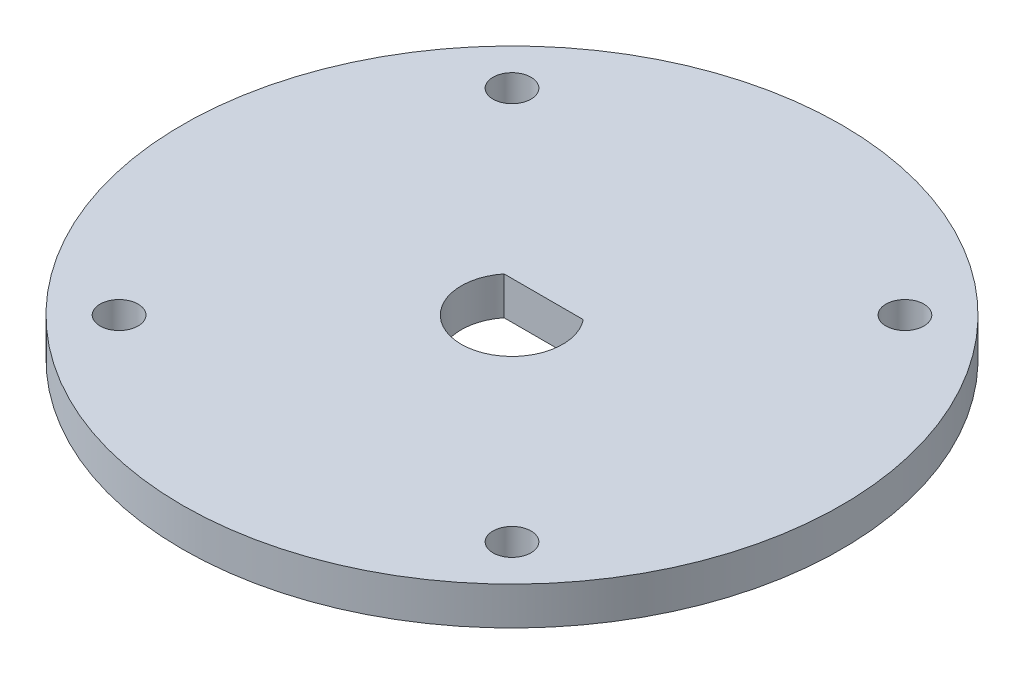
ISO-10303-21;
HEADER;
FILE_DESCRIPTION(('STEP AP214'),'2;1');
FILE_NAME('part.step','',(''),(''),'','','');
FILE_SCHEMA(('AUTOMOTIVE_DESIGN { 1 0 10303 214 1 1 1 1 }'));
ENDSEC;
DATA;
#1=APPLICATION_CONTEXT('core data for automotive mechanical design processes');
#2=APPLICATION_PROTOCOL_DEFINITION('international standard','automotive_design',2000,#1);
#3=PRODUCT_CONTEXT('',#1,'mechanical');
#4=PRODUCT('Part','Part','',(#3));
#5=PRODUCT_RELATED_PRODUCT_CATEGORY('part','',(#4));
#6=PRODUCT_DEFINITION_FORMATION('','',#4);
#7=PRODUCT_DEFINITION_CONTEXT('part definition',#1,'design');
#8=PRODUCT_DEFINITION('design','',#6,#7);
#9=PRODUCT_DEFINITION_SHAPE('','',#8);
#10=(LENGTH_UNIT() NAMED_UNIT(*) SI_UNIT(.MILLI.,.METRE.));
#11=(NAMED_UNIT(*) PLANE_ANGLE_UNIT() SI_UNIT($,.RADIAN.));
#12=(NAMED_UNIT(*) SI_UNIT($,.STERADIAN.) SOLID_ANGLE_UNIT());
#13=UNCERTAINTY_MEASURE_WITH_UNIT(LENGTH_MEASURE(1.E-05),#10,'distance_accuracy_value','');
#14=(GEOMETRIC_REPRESENTATION_CONTEXT(3) GLOBAL_UNCERTAINTY_ASSIGNED_CONTEXT((#13)) GLOBAL_UNIT_ASSIGNED_CONTEXT((#10,
#11,#12)) REPRESENTATION_CONTEXT('',''));
#15=CARTESIAN_POINT('',(0.,0.,0.));
#16=DIRECTION('',(0.,0.,1.));
#17=DIRECTION('',(1.,0.,0.));
#18=AXIS2_PLACEMENT_3D('',#15,#16,#17);
#19=CARTESIAN_POINT('',(-42.9521585143539,3.,-15.7788105290059));
#20=DIRECTION('',(0.,1.,0.));
#21=DIRECTION('',(0.,0.,1.));
#22=AXIS2_PLACEMENT_3D('',#19,#20,#21);
#23=PLANE('',#22);
#24=CARTESIAN_POINT('',(-27.4521585143539,3.,-0.278810529005875));
#25=DIRECTION('',(0.,1.,0.));
#26=DIRECTION('',(0.,0.,1.));
#27=AXIS2_PLACEMENT_3D('',#24,#25,#26);
#28=CIRCLE('',#27,1.5);
#29=CARTESIAN_POINT('',(-27.4521585143539,3.,1.22118947099413));
#30=VERTEX_POINT('',#29);
#31=EDGE_CURVE('E78',#30,#30,#28,.T.);
#32=ORIENTED_EDGE('',*,*,#31,.F.);
#33=EDGE_LOOP('',(#32));
#34=FACE_BOUND('',#33,.T.);
#35=CARTESIAN_POINT('',(-58.4521585143539,3.,-0.278810529005871));
#36=DIRECTION('',(0.,1.,0.));
#37=DIRECTION('',(0.,0.,1.));
#38=AXIS2_PLACEMENT_3D('',#35,#36,#37);
#39=CIRCLE('',#38,1.5);
#40=CARTESIAN_POINT('',(-58.4521585143539,3.,1.22118947099413));
#41=VERTEX_POINT('',#40);
#42=EDGE_CURVE('E90',#41,#41,#39,.T.);
#43=ORIENTED_EDGE('',*,*,#42,.F.);
#44=EDGE_LOOP('',(#43));
#45=FACE_BOUND('',#44,.T.);
#46=CARTESIAN_POINT('',(-42.9521585143539,3.,-15.7788105290059));
#47=DIRECTION('',(0.,1.,0.));
#48=DIRECTION('',(0.,0.,1.));
#49=AXIS2_PLACEMENT_3D('',#46,#47,#48);
#50=CIRCLE('',#49,26.);
#51=CARTESIAN_POINT('',(-42.9521585143539,3.,10.2211894709941));
#52=VERTEX_POINT('',#51);
#53=EDGE_CURVE('E11',#52,#52,#50,.T.);
#54=ORIENTED_EDGE('',*,*,#53,.T.);
#55=EDGE_LOOP('',(#54));
#56=FACE_BOUND('',#55,.T.);
#57=CARTESIAN_POINT('',(-58.4521585143539,3.,-31.2788105290059));
#58=DIRECTION('',(0.,1.,0.));
#59=DIRECTION('',(0.,0.,1.));
#60=AXIS2_PLACEMENT_3D('',#57,#58,#59);
#61=CIRCLE('',#60,1.5);
#62=CARTESIAN_POINT('',(-58.4521585143539,3.,-29.7788105290059));
#63=VERTEX_POINT('',#62);
#64=EDGE_CURVE('E96',#63,#63,#61,.T.);
#65=ORIENTED_EDGE('',*,*,#64,.F.);
#66=EDGE_LOOP('',(#65));
#67=FACE_BOUND('',#66,.T.);
#68=CARTESIAN_POINT('',(-27.4521585143539,3.,-31.2788105290059));
#69=DIRECTION('',(0.,1.,0.));
#70=DIRECTION('',(0.,0.,1.));
#71=AXIS2_PLACEMENT_3D('',#68,#69,#70);
#72=CIRCLE('',#71,1.5);
#73=CARTESIAN_POINT('',(-27.4521585143539,3.,-29.7788105290059));
#74=VERTEX_POINT('',#73);
#75=EDGE_CURVE('E84',#74,#74,#72,.T.);
#76=ORIENTED_EDGE('',*,*,#75,.F.);
#77=EDGE_LOOP('',(#76));
#78=FACE_BOUND('',#77,.T.);
#79=DIRECTION('',(-1.,0.,0.));
#80=VECTOR('',#79,1.);
#81=CARTESIAN_POINT('',(-46.0746575135531,3.,-18.2788105290059));
#82=LINE('',#81,#80);
#83=CARTESIAN_POINT('',(-39.8296595151547,3.,-18.2788105290059));
#84=VERTEX_POINT('',#83);
#85=CARTESIAN_POINT('',(-46.0746575135531,3.,-18.2788105290059));
#86=VERTEX_POINT('',#85);
#87=EDGE_CURVE('E74',#84,#86,#82,.T.);
#88=ORIENTED_EDGE('',*,*,#87,.F.);
#89=CARTESIAN_POINT('',(-42.9521585143539,3.,-15.7788105290059));
#90=DIRECTION('',(0.,1.,0.));
#91=DIRECTION('',(0.,0.,1.));
#92=AXIS2_PLACEMENT_3D('',#89,#90,#91);
#93=CIRCLE('',#92,4.);
#94=EDGE_CURVE('E64',#86,#84,#93,.T.);
#95=ORIENTED_EDGE('',*,*,#94,.F.);
#96=EDGE_LOOP('',(#88,#95));
#97=FACE_BOUND('',#96,.T.);
#98=ADVANCED_FACE('F32',(#34,#45,#56,#67,#78,#97),#23,.T.);
#99=CARTESIAN_POINT('',(-42.9521585143539,0.,-15.7788105290059));
#100=DIRECTION('',(0.,1.,0.));
#101=DIRECTION('',(0.,0.,1.));
#102=AXIS2_PLACEMENT_3D('',#99,#100,#101);
#103=PLANE('',#102);
#104=CARTESIAN_POINT('',(-27.4521585143539,0.,-0.278810529005875));
#105=DIRECTION('',(0.,1.,0.));
#106=DIRECTION('',(0.,0.,1.));
#107=AXIS2_PLACEMENT_3D('',#104,#105,#106);
#108=CIRCLE('',#107,1.5);
#109=CARTESIAN_POINT('',(-27.4521585143539,0.,1.22118947099413));
#110=VERTEX_POINT('',#109);
#111=EDGE_CURVE('E69',#110,#110,#108,.T.);
#112=ORIENTED_EDGE('',*,*,#111,.T.);
#113=EDGE_LOOP('',(#112));
#114=FACE_BOUND('',#113,.T.);
#115=CARTESIAN_POINT('',(-58.4521585143539,0.,-0.278810529005871));
#116=DIRECTION('',(0.,1.,0.));
#117=DIRECTION('',(0.,0.,1.));
#118=AXIS2_PLACEMENT_3D('',#115,#116,#117);
#119=CIRCLE('',#118,1.5);
#120=CARTESIAN_POINT('',(-58.4521585143539,0.,1.22118947099413));
#121=VERTEX_POINT('',#120);
#122=EDGE_CURVE('E87',#121,#121,#119,.T.);
#123=ORIENTED_EDGE('',*,*,#122,.T.);
#124=EDGE_LOOP('',(#123));
#125=FACE_BOUND('',#124,.T.);
#126=CARTESIAN_POINT('',(-42.9521585143539,0.,-15.7788105290059));
#127=DIRECTION('',(0.,1.,0.));
#128=DIRECTION('',(0.,0.,1.));
#129=AXIS2_PLACEMENT_3D('',#126,#127,#128);
#130=CIRCLE('',#129,26.);
#131=CARTESIAN_POINT('',(-42.9521585143539,0.,10.2211894709941));
#132=VERTEX_POINT('',#131);
#133=EDGE_CURVE('E36',#132,#132,#130,.T.);
#134=ORIENTED_EDGE('',*,*,#133,.F.);
#135=EDGE_LOOP('',(#134));
#136=FACE_BOUND('',#135,.T.);
#137=CARTESIAN_POINT('',(-58.4521585143539,0.,-31.2788105290059));
#138=DIRECTION('',(0.,1.,0.));
#139=DIRECTION('',(0.,0.,1.));
#140=AXIS2_PLACEMENT_3D('',#137,#138,#139);
#141=CIRCLE('',#140,1.5);
#142=CARTESIAN_POINT('',(-58.4521585143539,0.,-29.7788105290059));
#143=VERTEX_POINT('',#142);
#144=EDGE_CURVE('E93',#143,#143,#141,.T.);
#145=ORIENTED_EDGE('',*,*,#144,.T.);
#146=EDGE_LOOP('',(#145));
#147=FACE_BOUND('',#146,.T.);
#148=CARTESIAN_POINT('',(-27.4521585143539,0.,-31.2788105290059));
#149=DIRECTION('',(0.,1.,0.));
#150=DIRECTION('',(0.,0.,1.));
#151=AXIS2_PLACEMENT_3D('',#148,#149,#150);
#152=CIRCLE('',#151,1.5);
#153=CARTESIAN_POINT('',(-27.4521585143539,0.,-29.7788105290059));
#154=VERTEX_POINT('',#153);
#155=EDGE_CURVE('E81',#154,#154,#152,.T.);
#156=ORIENTED_EDGE('',*,*,#155,.T.);
#157=EDGE_LOOP('',(#156));
#158=FACE_BOUND('',#157,.T.);
#159=CARTESIAN_POINT('',(-42.9521585143539,0.,-15.7788105290059));
#160=DIRECTION('',(0.,1.,0.));
#161=DIRECTION('',(0.,0.,1.));
#162=AXIS2_PLACEMENT_3D('',#159,#160,#161);
#163=CIRCLE('',#162,4.);
#164=CARTESIAN_POINT('',(-46.0746575135531,0.,-18.2788105290059));
#165=VERTEX_POINT('',#164);
#166=CARTESIAN_POINT('',(-39.8296595151547,0.,-18.2788105290059));
#167=VERTEX_POINT('',#166);
#168=EDGE_CURVE('E54',#165,#167,#163,.T.);
#169=ORIENTED_EDGE('',*,*,#168,.T.);
#170=DIRECTION('',(-1.,0.,0.));
#171=VECTOR('',#170,1.);
#172=CARTESIAN_POINT('',(-46.0746575135531,0.,-18.2788105290059));
#173=LINE('',#172,#171);
#174=EDGE_CURVE('E60',#167,#165,#173,.T.);
#175=ORIENTED_EDGE('',*,*,#174,.T.);
#176=EDGE_LOOP('',(#169,#175));
#177=FACE_BOUND('',#176,.T.);
#178=ADVANCED_FACE('F71',(#114,#125,#136,#147,#158,#177),#103,.F.);
#179=CARTESIAN_POINT('',(-42.9521585143539,3.,-15.7788105290059));
#180=DIRECTION('',(0.,-1.,0.));
#181=DIRECTION('',(0.,0.,-1.));
#182=AXIS2_PLACEMENT_3D('',#179,#180,#181);
#183=CYLINDRICAL_SURFACE('',#182,26.);
#184=ORIENTED_EDGE('',*,*,#53,.F.);
#185=EDGE_LOOP('',(#184));
#186=FACE_BOUND('',#185,.T.);
#187=ORIENTED_EDGE('',*,*,#133,.T.);
#188=EDGE_LOOP('',(#187));
#189=FACE_BOUND('',#188,.T.);
#190=ADVANCED_FACE('F34',(#186,#189),#183,.T.);
#191=CARTESIAN_POINT('',(-58.4521585143539,3.,-31.2788105290059));
#192=DIRECTION('',(0.,-1.,0.));
#193=DIRECTION('',(0.,0.,-1.));
#194=AXIS2_PLACEMENT_3D('',#191,#192,#193);
#195=CYLINDRICAL_SURFACE('',#194,1.5);
#196=ORIENTED_EDGE('',*,*,#64,.T.);
#197=EDGE_LOOP('',(#196));
#198=FACE_BOUND('',#197,.T.);
#199=ORIENTED_EDGE('',*,*,#144,.F.);
#200=EDGE_LOOP('',(#199));
#201=FACE_BOUND('',#200,.T.);
#202=ADVANCED_FACE('F104',(#198,#201),#195,.F.);
#203=CARTESIAN_POINT('',(-58.4521585143539,3.,-0.278810529005871));
#204=DIRECTION('',(0.,-1.,0.));
#205=DIRECTION('',(0.,0.,-1.));
#206=AXIS2_PLACEMENT_3D('',#203,#204,#205);
#207=CYLINDRICAL_SURFACE('',#206,1.5);
#208=ORIENTED_EDGE('',*,*,#42,.T.);
#209=EDGE_LOOP('',(#208));
#210=FACE_BOUND('',#209,.T.);
#211=ORIENTED_EDGE('',*,*,#122,.F.);
#212=EDGE_LOOP('',(#211));
#213=FACE_BOUND('',#212,.T.);
#214=ADVANCED_FACE('F106',(#210,#213),#207,.F.);
#215=CARTESIAN_POINT('',(-27.4521585143539,3.,-31.2788105290059));
#216=DIRECTION('',(0.,-1.,0.));
#217=DIRECTION('',(0.,0.,-1.));
#218=AXIS2_PLACEMENT_3D('',#215,#216,#217);
#219=CYLINDRICAL_SURFACE('',#218,1.5);
#220=ORIENTED_EDGE('',*,*,#75,.T.);
#221=EDGE_LOOP('',(#220));
#222=FACE_BOUND('',#221,.T.);
#223=ORIENTED_EDGE('',*,*,#155,.F.);
#224=EDGE_LOOP('',(#223));
#225=FACE_BOUND('',#224,.T.);
#226=ADVANCED_FACE('F113',(#222,#225),#219,.F.);
#227=CARTESIAN_POINT('',(-27.4521585143539,3.,-0.278810529005875));
#228=DIRECTION('',(0.,-1.,0.));
#229=DIRECTION('',(0.,0.,-1.));
#230=AXIS2_PLACEMENT_3D('',#227,#228,#229);
#231=CYLINDRICAL_SURFACE('',#230,1.5);
#232=ORIENTED_EDGE('',*,*,#31,.T.);
#233=EDGE_LOOP('',(#232));
#234=FACE_BOUND('',#233,.T.);
#235=ORIENTED_EDGE('',*,*,#111,.F.);
#236=EDGE_LOOP('',(#235));
#237=FACE_BOUND('',#236,.T.);
#238=ADVANCED_FACE('F137',(#234,#237),#231,.F.);
#239=CARTESIAN_POINT('',(-42.9521585143539,3.,-15.7788105290059));
#240=DIRECTION('',(0.,-1.,0.));
#241=DIRECTION('',(0.,0.,-1.));
#242=AXIS2_PLACEMENT_3D('',#239,#240,#241);
#243=CYLINDRICAL_SURFACE('',#242,4.);
#244=ORIENTED_EDGE('',*,*,#168,.F.);
#245=DIRECTION('',(0.,-1.,0.));
#246=VECTOR('',#245,1.);
#247=CARTESIAN_POINT('',(-46.0746575135531,3.,-18.2788105290059));
#248=LINE('',#247,#246);
#249=EDGE_CURVE('E62',#86,#165,#248,.T.);
#250=ORIENTED_EDGE('',*,*,#249,.F.);
#251=ORIENTED_EDGE('',*,*,#94,.T.);
#252=DIRECTION('',(0.,-1.,0.));
#253=VECTOR('',#252,1.);
#254=CARTESIAN_POINT('',(-39.8296595151547,3.,-18.2788105290059));
#255=LINE('',#254,#253);
#256=EDGE_CURVE('E47',#84,#167,#255,.T.);
#257=ORIENTED_EDGE('',*,*,#256,.T.);
#258=EDGE_LOOP('',(#244,#250,#251,#257));
#259=FACE_BOUND('',#258,.T.);
#260=ADVANCED_FACE('F66',(#259),#243,.F.);
#261=CARTESIAN_POINT('',(-46.0746575135531,3.,-18.2788105290059));
#262=DIRECTION('',(0.,0.,1.));
#263=DIRECTION('',(1.,0.,0.));
#264=AXIS2_PLACEMENT_3D('',#261,#262,#263);
#265=PLANE('',#264);
#266=ORIENTED_EDGE('',*,*,#174,.F.);
#267=ORIENTED_EDGE('',*,*,#256,.F.);
#268=ORIENTED_EDGE('',*,*,#87,.T.);
#269=ORIENTED_EDGE('',*,*,#249,.T.);
#270=EDGE_LOOP('',(#266,#267,#268,#269));
#271=FACE_BOUND('',#270,.T.);
#272=ADVANCED_FACE('F61',(#271),#265,.T.);
#273=CLOSED_SHELL('',(#98,#178,#190,#202,#214,#226,#238,#260,#272));
#274=MANIFOLD_SOLID_BREP('B2',#273);
#275=ADVANCED_BREP_SHAPE_REPRESENTATION('',(#18,#274),#14);
#276=SHAPE_DEFINITION_REPRESENTATION(#9,#275);
ENDSEC;
END-ISO-10303-21;
